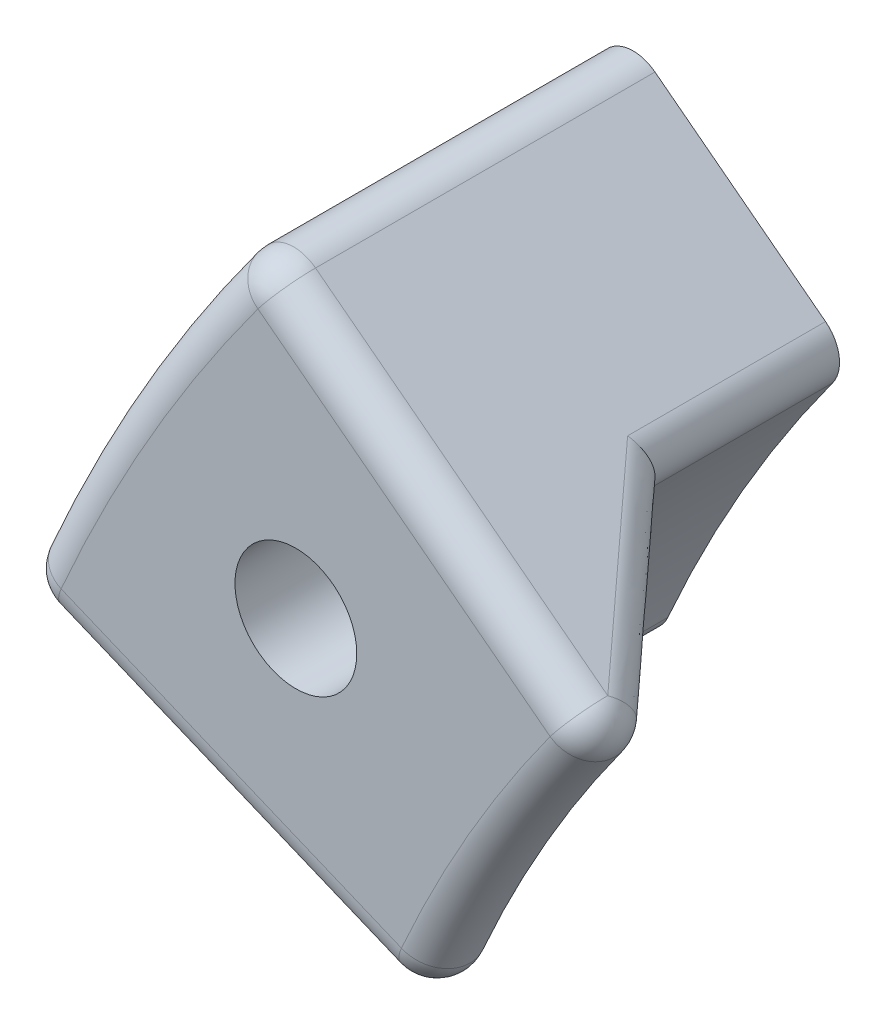
ISO-10303-21;
HEADER;
FILE_DESCRIPTION(('STEP AP214'),'2;1');
FILE_NAME('part.step','',(''),(''),'','','');
FILE_SCHEMA(('AUTOMOTIVE_DESIGN { 1 0 10303 214 1 1 1 1 }'));
ENDSEC;
DATA;
#1=APPLICATION_CONTEXT('core data for automotive mechanical design processes');
#2=APPLICATION_PROTOCOL_DEFINITION('international standard','automotive_design',2000,#1);
#3=PRODUCT_CONTEXT('',#1,'mechanical');
#4=PRODUCT('Part','Part','',(#3));
#5=PRODUCT_RELATED_PRODUCT_CATEGORY('part','',(#4));
#6=PRODUCT_DEFINITION_FORMATION('','',#4);
#7=PRODUCT_DEFINITION_CONTEXT('part definition',#1,'design');
#8=PRODUCT_DEFINITION('design','',#6,#7);
#9=PRODUCT_DEFINITION_SHAPE('','',#8);
#10=(LENGTH_UNIT() NAMED_UNIT(*) SI_UNIT(.MILLI.,.METRE.));
#11=(NAMED_UNIT(*) PLANE_ANGLE_UNIT() SI_UNIT($,.RADIAN.));
#12=(NAMED_UNIT(*) SI_UNIT($,.STERADIAN.) SOLID_ANGLE_UNIT());
#13=UNCERTAINTY_MEASURE_WITH_UNIT(LENGTH_MEASURE(1.E-05),#10,'distance_accuracy_value','');
#14=(GEOMETRIC_REPRESENTATION_CONTEXT(3) GLOBAL_UNCERTAINTY_ASSIGNED_CONTEXT((#13)) GLOBAL_UNIT_ASSIGNED_CONTEXT((#10,
#11,#12)) REPRESENTATION_CONTEXT('',''));
#15=CARTESIAN_POINT('',(0.,0.,0.));
#16=DIRECTION('',(0.,0.,1.));
#17=DIRECTION('',(1.,0.,0.));
#18=AXIS2_PLACEMENT_3D('',#15,#16,#17);
#19=CARTESIAN_POINT('',(0.,15.9999999999999,11.));
#20=DIRECTION('',(0.,0.,-1.));
#21=DIRECTION('',(-1.,0.,0.));
#22=AXIS2_PLACEMENT_3D('',#19,#20,#21);
#23=CYLINDRICAL_SURFACE('',#22,50.7);
#24=CARTESIAN_POINT('',(0.,15.9999999999999,0.));
#25=DIRECTION('',(0.,0.,-1.));
#26=DIRECTION('',(-1.,0.,0.));
#27=AXIS2_PLACEMENT_3D('',#24,#25,#26);
#28=CIRCLE('',#27,50.7);
#29=CARTESIAN_POINT('',(-46.4408264622342,36.3405908838619,0.));
#30=VERTEX_POINT('',#29);
#31=CARTESIAN_POINT('',(-40.8358816645273,46.048640047109,0.));
#32=VERTEX_POINT('',#31);
#33=EDGE_CURVE('E174',#30,#32,#28,.T.);
#34=ORIENTED_EDGE('',*,*,#33,.F.);
#35=DIRECTION('',(0.,0.,-1.));
#36=VECTOR('',#35,1.);
#37=CARTESIAN_POINT('',(-46.4408264622342,36.3405908838619,11.));
#38=LINE('',#37,#36);
#39=CARTESIAN_POINT('',(-46.4408264622342,36.3405908838619,9.47750838033255));
#40=VERTEX_POINT('',#39);
#41=EDGE_CURVE('E398',#30,#40,#38,.F.);
#42=ORIENTED_EDGE('',*,*,#41,.T.);
#43=CARTESIAN_POINT('',(0.,15.9999999999999,9.47750838033255));
#44=DIRECTION('',(0.,0.,1.));
#45=DIRECTION('',(1.,0.,0.));
#46=AXIS2_PLACEMENT_3D('',#43,#44,#45);
#47=CIRCLE('',#46,50.7);
#48=CARTESIAN_POINT('',(-40.8358816645273,46.048640047109,9.47750838033255));
#49=VERTEX_POINT('',#48);
#50=EDGE_CURVE('E392',#40,#49,#47,.F.);
#51=ORIENTED_EDGE('',*,*,#50,.T.);
#52=DIRECTION('',(0.,0.,-1.));
#53=VECTOR('',#52,1.);
#54=CARTESIAN_POINT('',(-40.8358816645273,46.048640047109,11.));
#55=LINE('',#54,#53);
#56=EDGE_CURVE('E395',#49,#32,#55,.T.);
#57=ORIENTED_EDGE('',*,*,#56,.T.);
#58=EDGE_LOOP('',(#34,#42,#51,#57));
#59=FACE_BOUND('',#58,.T.);
#60=ADVANCED_FACE('F45',(#59),#23,.T.);
#61=CARTESIAN_POINT('',(7.39103626009033,12.9385325410792,10.4775083803325));
#62=DIRECTION('',(0.,0.,1.));
#63=DIRECTION('',(1.,0.,0.));
#64=AXIS2_PLACEMENT_3D('',#61,#62,#63);
#65=PLANE('',#64);
#66=CARTESIAN_POINT('',(-38.9711431702996,38.5000000000002,10.4775083803325));
#67=DIRECTION('',(0.,0.,1.));
#68=DIRECTION('',(1.,0.,0.));
#69=AXIS2_PLACEMENT_3D('',#66,#67,#68);
#70=CIRCLE('',#69,1.70000000000001);
#71=CARTESIAN_POINT('',(-37.2711431702996,38.5000000000002,10.4775083803325));
#72=VERTEX_POINT('',#71);
#73=EDGE_CURVE('E290',#72,#72,#70,.T.);
#74=ORIENTED_EDGE('',*,*,#73,.F.);
#75=EDGE_LOOP('',(#74));
#76=FACE_BOUND('',#75,.T.);
#77=DIRECTION('',(0.793353340291231,-0.608761429008726,0.));
#78=VECTOR('',#77,1.);
#79=CARTESIAN_POINT('',(5.52180241707132,10.5024995690833,10.4775083803325));
#80=LINE('',#79,#78);
#81=CARTESIAN_POINT('',(-31.8715321637125,39.1954143634461,10.4775083803325));
#82=VERTEX_POINT('',#81);
#83=CARTESIAN_POINT('',(-40.0304402115781,45.4559647010122,10.4775083803325));
#84=VERTEX_POINT('',#83);
#85=EDGE_CURVE('E402',#82,#84,#80,.F.);
#86=ORIENTED_EDGE('',*,*,#85,.T.);
#87=CARTESIAN_POINT('',(0.,15.9999999999999,10.4775083803325));
#88=DIRECTION('',(0.,0.,1.));
#89=DIRECTION('',(1.,0.,0.));
#90=AXIS2_PLACEMENT_3D('',#87,#88,#89);
#91=CIRCLE('',#90,49.7);
#92=CARTESIAN_POINT('',(-45.524833829843,35.9393957973952,10.4775083803325));
#93=VERTEX_POINT('',#92);
#94=EDGE_CURVE('E156',#84,#93,#91,.T.);
#95=ORIENTED_EDGE('',*,*,#94,.T.);
#96=DIRECTION('',(0.923879532511285,-0.382683432365095,0.));
#97=VECTOR('',#96,1.);
#98=CARTESIAN_POINT('',(-33.672343951946,31.0299337420803,10.4775083803325));
#99=LINE('',#98,#97);
#100=CARTESIAN_POINT('',(-36.0235841719069,32.0038493295852,10.4775083803325));
#101=VERTEX_POINT('',#100);
#102=EDGE_CURVE('E362',#93,#101,#99,.T.);
#103=ORIENTED_EDGE('',*,*,#102,.T.);
#104=CARTESIAN_POINT('',(0.,15.9999999999999,10.4775083803325));
#105=DIRECTION('',(0.,0.,1.));
#106=DIRECTION('',(1.,0.,0.));
#107=AXIS2_PLACEMENT_3D('',#104,#105,#106);
#108=CIRCLE('',#107,39.4185465226019);
#109=EDGE_CURVE('E400',#101,#82,#108,.F.);
#110=ORIENTED_EDGE('',*,*,#109,.T.);
#111=EDGE_LOOP('',(#86,#95,#103,#110));
#112=FACE_BOUND('',#111,.T.);
#113=ADVANCED_FACE('F195',(#76,#112),#65,.T.);
#114=CARTESIAN_POINT('',(0.,15.9999999999999,10.4775083803325));
#115=DIRECTION('',(0.,0.,-1.));
#116=DIRECTION('',(-1.,0.,0.));
#117=AXIS2_PLACEMENT_3D('',#114,#115,#116);
#118=CONICAL_SURFACE('',#117,36.8608960215223,0.82537685052074);
#119=CARTESIAN_POINT('',(0.,15.9999999999999,8.74270493570506));
#120=DIRECTION('',(0.,0.,1.));
#121=DIRECTION('',(1.,0.,0.));
#122=AXIS2_PLACEMENT_3D('',#119,#120,#121);
#123=CIRCLE('',#122,38.7402664198688);
#124=CARTESIAN_POINT('',(-31.3231145274136,38.7962878246643,8.74270493570506));
#125=VERTEX_POINT('',#124);
#126=CARTESIAN_POINT('',(-35.4037216318479,31.7284689940578,8.74270493570506));
#127=VERTEX_POINT('',#126);
#128=EDGE_CURVE('E164',#125,#127,#123,.T.);
#129=ORIENTED_EDGE('',*,*,#128,.T.);
#130=CARTESIAN_POINT('',(-57.0560553569971,40.7041034612373,-12.8890269101578));
#131=CARTESIAN_POINT('',(-57.4412985100991,39.7929648832049,-12.8811819059078));
#132=CARTESIAN_POINT('',(-58.0611788304999,40.049727718963,-12.1542234655303));
#133=CARTESIAN_POINT('',(-53.6085180772676,39.2753423746649,-9.44467818698398));
#134=CARTESIAN_POINT('',(-53.9937501242067,38.3649435848307,-9.43617150696224));
#135=CARTESIAN_POINT('',(-54.6133667642921,38.6215972006262,-8.70987474235716));
#136=CARTESIAN_POINT('',(-50.160981542416,37.8465493087946,-6.00034038840782));
#137=CARTESIAN_POINT('',(-50.5477800955023,36.9375760634102,-5.99271766851962));
#138=CARTESIAN_POINT('',(-51.1655453720429,37.1934628193164,-5.26553694378046));
#139=CARTESIAN_POINT('',(-43.2659503160032,34.9885137912344,0.888176626190312));
#140=CARTESIAN_POINT('',(-43.6538842403825,34.0820309026318,0.896426533633099));
#141=CARTESIAN_POINT('',(-44.2697674695047,34.3371380889724,1.62298007081854));
#142=CARTESIAN_POINT('',(-39.8184556244414,33.5592713395513,4.33235584221468));
#143=CARTESIAN_POINT('',(-40.2074205279736,32.6544588907253,4.34065553151519));
#144=CARTESIAN_POINT('',(-40.8218109592178,32.9089477399389,5.06715928684324));
#145=CARTESIAN_POINT('',(-34.6472751144234,31.4147815023974,9.49840329950107));
#146=CARTESIAN_POINT('',(-35.034658844084,30.5118308463343,9.51045366323894));
#147=CARTESIAN_POINT('',(-35.649687385489,30.7665840094308,10.233206744128));
#148=CARTESIAN_POINT('',(-32.9235585112219,30.6998471879928,11.2203822451988));
#149=CARTESIAN_POINT('',(-33.3113881168769,29.7980287394846,11.23280201));
#150=CARTESIAN_POINT('',(-33.9256147051076,30.0524497226999,11.9551856898249));
#151=CARTESIAN_POINT('',(-29.4761609490719,29.2696373801796,14.664219140246));
#152=CARTESIAN_POINT('',(-29.8644724464889,28.3702695204535,14.6780839910781));
#153=CARTESIAN_POINT('',(-30.4773662152739,28.6241384317782,15.3990225848749));
#154=CARTESIAN_POINT('',(-27.7524799901233,28.5543618867728,16.386077089596));
#155=CARTESIAN_POINT('',(-28.1413806570758,27.6565415320648,16.4004645185635));
#156=CARTESIAN_POINT('',(-28.7531904058223,27.9099614275877,17.1208805342287));
#157=CARTESIAN_POINT('',(-24.3051801872967,27.1232514841119,19.8295940307751));
#158=CARTESIAN_POINT('',(-24.6947615808185,26.2289051663452,19.8460046580516));
#159=CARTESIAN_POINT('',(-25.3046691372555,26.4815371480152,20.5643974754077));
#160=CARTESIAN_POINT('',(-22.58156134342,26.4074165748464,21.5512530226));
#161=CARTESIAN_POINT('',(-22.9721393065628,25.5153716575025,21.5682590461862));
#162=CARTESIAN_POINT('',(-23.5803236781369,25.7672898726319,22.2860564672288));
#163=CARTESIAN_POINT('',(-19.9962294741058,25.3328740200403,24.1334589348808));
#164=CARTESIAN_POINT('',(-20.3860935203517,24.444196419936,24.1542328372365));
#165=CARTESIAN_POINT('',(-20.9935646826547,24.6958192141125,24.868262379508));
#166=CARTESIAN_POINT('',(-19.1344682428935,24.9745614668214,24.9941471505793));
#167=CARTESIAN_POINT('',(-19.5247543873657,24.0874180692506,25.0156277247592));
#168=CARTESIAN_POINT('',(-20.1312715421626,24.3386457005794,25.7289505952066));
#169=CARTESIAN_POINT('',(-17.4109994573508,24.257530602391,26.7153777212736));
#170=CARTESIAN_POINT('',(-17.8018167429931,23.3737539298282,26.7389207855883));
#171=CARTESIAN_POINT('',(-18.4065609993268,23.6242472025689,27.4501811659012));
#172=CARTESIAN_POINT('',(-16.549291903021,23.8988122911757,27.575920076268));
#173=CARTESIAN_POINT('',(-16.9405453347794,23.017003631662,27.6004914454683));
#174=CARTESIAN_POINT('',(-17.5441435969817,23.267022218091,28.3107235208959));
#175=CARTESIAN_POINT('',(-15.6876219653317,23.5398199228824,28.436363660635));
#176=CARTESIAN_POINT('',(-16.0785716113142,22.6599624249934,28.4629280870104));
#177=CARTESIAN_POINT('',(-16.6816420730981,22.909762389331,29.1711671052625));
#178=(BOUNDED_SURFACE() B_SPLINE_SURFACE(3,2,((#130,#131,#132),(#133,#134,#135),(#136,#137,
#138),(#139,#140,#141),(#142,#143,#144),(#145,#146,#147),(#148,#149,#150),(#151,#152,#153),
(#154,#155,#156),(#157,#158,#159),(#160,#161,#162),(#163,#164,#165),(#166,#167,#168),(#169,#170,
#171),(#172,#173,#174),(#175,#176,#177)),.UNSPECIFIED.,.F.,.F.,
.F.) B_SPLINE_SURFACE_WITH_KNOTS((4,2,2,2,2,2,2,4),(3,3),(0.,15.2353052798517,30.4706103295352,
38.0882630407243,45.7059157124317,53.3235685387299,57.1323950183959,60.9412215349687),(0.,1.),
.UNSPECIFIED.) GEOMETRIC_REPRESENTATION_ITEM() RATIONAL_B_SPLINE_SURFACE(((1.,0.710911929970982,
1.),(1.,0.711153587269838,1.),(1.,0.711405958849922,1.),(1.,0.712061621390674,1.),(1.,
0.712464912349062,1.),(1.,0.713280156441932,1.),(1.,0.713586955753808,1.),(1.,0.714315174736751,
1.),(1.,0.714736594407223,1.),(1.,0.715767409611829,1.),(1.,0.716376805149779,1.),(1.,
0.717556536238839,1.),(1.,0.717994052903862,1.),(1.,0.719005547590785,1.),(1.,0.719579525614007,
1.),(1.,0.720245692027132,1.))) REPRESENTATION_ITEM('') SURFACE());
#179=CARTESIAN_POINT('',(-15.6876219653317,23.5398199228824,28.436363660635));
#180=CARTESIAN_POINT('',(-16.549291903021,23.8988122911757,27.575920076268));
#181=CARTESIAN_POINT('',(-17.4109994573508,24.257530602391,26.7153777212736));
#182=CARTESIAN_POINT('',(-19.1344682428935,24.9745614668214,24.9941471505793));
#183=CARTESIAN_POINT('',(-19.9962294741058,25.3328740200403,24.1334589348808));
#184=CARTESIAN_POINT('',(-22.58156134342,26.4074165748464,21.5512530226));
#185=CARTESIAN_POINT('',(-24.3051801872967,27.1232514841119,19.8295940307751));
#186=CARTESIAN_POINT('',(-27.7524799901233,28.5543618867728,16.386077089596));
#187=CARTESIAN_POINT('',(-29.4761609490719,29.2696373801796,14.664219140246));
#188=CARTESIAN_POINT('',(-32.9235585112219,30.6998471879928,11.2203822451988));
#189=CARTESIAN_POINT('',(-34.6472751144234,31.4147815023974,9.49840329950107));
#190=CARTESIAN_POINT('',(-39.8184556244414,33.5592713395513,4.33235584221468));
#191=CARTESIAN_POINT('',(-43.2659503160032,34.9885137912344,0.888176626190309));
#192=CARTESIAN_POINT('',(-50.160981542416,37.8465493087946,-6.00034038840781));
#193=CARTESIAN_POINT('',(-53.6085180772676,39.2753423746649,-9.44467818698397));
#194=CARTESIAN_POINT('',(-57.0560553569971,40.7041034612373,-12.8890269101578));
#195=B_SPLINE_CURVE_WITH_KNOTS('',3,(#179,#180,#181,#182,#183,#184,#185,#186,#187,#188,#189,
#190,#191,#192,#193,#194),.UNSPECIFIED.,.F.,.F.,(4,2,2,2,2,2,2,4),(0.,3.80882651657277,
7.61765299623877,15.235305822537,22.8529584942444,30.4706112054334,45.705916255117,
60.9412215349687),.UNSPECIFIED.);
#196=CARTESIAN_POINT('',(-39.0624724144514,33.2456733376875,5.08756624635315));
#197=VERTEX_POINT('',#196);
#198=EDGE_CURVE('E152',#127,#197,#195,.T.);
#199=ORIENTED_EDGE('',*,*,#198,.T.);
#200=CARTESIAN_POINT('',(0.,15.9999999999999,5.08756624635315));
#201=DIRECTION('',(0.,0.,-1.));
#202=DIRECTION('',(-1.,0.,0.));
#203=AXIS2_PLACEMENT_3D('',#200,#201,#202);
#204=CIRCLE('',#203,42.7);
#205=CARTESIAN_POINT('',(-34.4664274230308,41.2062567767004,5.08756624635315));
#206=VERTEX_POINT('',#205);
#207=EDGE_CURVE('E161',#197,#206,#204,.T.);
#208=ORIENTED_EDGE('',*,*,#207,.T.);
#209=CARTESIAN_POINT('',(-27.6852817804571,36.0077333479931,12.9722831735129));
#210=CARTESIAN_POINT('',(-27.0986461547945,36.7935225322664,12.9863168379847));
#211=CARTESIAN_POINT('',(-27.6262672041879,37.1983804028917,13.7070866181404));
#212=CARTESIAN_POINT('',(-28.4301556209873,36.5786341069799,12.1063274222114));
#213=CARTESIAN_POINT('',(-27.8431226662879,37.3647794514517,12.1197655074681));
#214=CARTESIAN_POINT('',(-28.3708337284711,37.7697063913199,12.8411308668389));
#215=CARTESIAN_POINT('',(-29.1749939251547,37.1495606462699,11.2403561871437));
#216=CARTESIAN_POINT('',(-28.5873921531294,37.9358775150344,11.2534821721267));
#217=CARTESIAN_POINT('',(-29.1153889180281,38.3410236823067,11.9751596317712));
#218=CARTESIAN_POINT('',(-30.6646134305598,38.2914549552782,9.50838889756597));
#219=CARTESIAN_POINT('',(-30.0759924519179,39.0781206986084,9.52088757750443));
#220=CARTESIAN_POINT('',(-30.604481126791,39.4836443216797,10.2431923421935));
#221=CARTESIAN_POINT('',(-31.4093946317975,38.8624227249965,8.64239284305605));
#222=CARTESIAN_POINT('',(-30.8202741597744,39.6492281397057,8.65463349005064));
#223=CARTESIAN_POINT('',(-31.349018145997,40.0549476700659,9.37719628768353));
#224=CARTESIAN_POINT('',(-35.0127918978318,41.6250313272277,4.45236788722416));
#225=CARTESIAN_POINT('',(-34.4235701911246,42.4141344302383,4.46091129059091));
#226=CARTESIAN_POINT('',(-34.9513052505917,42.8190797838701,5.18717133185165));
#227=CARTESIAN_POINT('',(-37.871111799266,43.8168843385272,1.12821077319941));
#228=CARTESIAN_POINT('',(-37.2800210856329,44.6059662914312,1.13665265313202));
#229=CARTESIAN_POINT('',(-37.8089614700305,45.0118365234114,1.86301421782692));
#230=CARTESIAN_POINT('',(-43.5874016297553,48.2008383653572,-5.52025413191054));
#231=CARTESIAN_POINT('',(-42.9937103584226,48.9902342713686,-5.51251351431314));
#232=CARTESIAN_POINT('',(-43.524163599225,49.3972653588972,-4.78545068728302));
#233=CARTESIAN_POINT('',(-46.4453715588095,50.3929393808884,-8.84456192299612));
#234=CARTESIAN_POINT('',(-45.8497971808394,51.1817867702201,-8.83608070721259));
#235=CARTESIAN_POINT('',(-46.3817095089803,51.5899374548415,-8.1097584783686));
#236=CARTESIAN_POINT('',(-49.303309237866,52.5850607659501,-12.1688828339845));
#237=CARTESIAN_POINT('',(-48.7070156260032,53.3742075937457,-12.1609402962573));
#238=CARTESIAN_POINT('',(-49.2392458030807,53.782602172434,-11.434079389357));
#239=(BOUNDED_SURFACE() B_SPLINE_SURFACE(3,2,((#209,#210,#211),(#212,#213,#214),(#215,#216,
#217),(#218,#219,#220),(#221,#222,#223),(#224,#225,#226),(#227,#228,#229),(#230,#231,#232),
(#233,#234,#235),(#236,#237,#238)),.UNSPECIFIED.,.F.,.F.,.F.) B_SPLINE_SURFACE_WITH_KNOTS((4,2,
2,2,4),(3,3),(0.,3.83093311252118,7.66186622261852,22.3662742399369,37.0706822936641),(0.,1.),
.UNSPECIFIED.) GEOMETRIC_REPRESENTATION_ITEM() RATIONAL_B_SPLINE_SURFACE(((1.,0.713957416134274,
1.),(1.,0.713773777055552,1.),(1.,0.713604807373312,1.),(1.,0.713290405298534,1.),(1.,
0.713144972905981,1.),(1.,0.712484227988163,1.),(1.,0.712090696663566,1.),(1.,0.711447059710365,
1.),(1.,0.711196954082115,1.),(1.,0.710959625056789,1.))) REPRESENTATION_ITEM('') SURFACE());
#240=CARTESIAN_POINT('',(-49.303309237866,52.5850607659501,-12.1688828339845));
#241=CARTESIAN_POINT('',(-46.4453715588095,50.3929393808884,-8.84456192299613));
#242=CARTESIAN_POINT('',(-43.5874016297553,48.2008383653572,-5.52025413191054));
#243=CARTESIAN_POINT('',(-37.871111799266,43.8168843385272,1.12821077319942));
#244=CARTESIAN_POINT('',(-35.0127918978318,41.6250313272277,4.45236788722416));
#245=CARTESIAN_POINT('',(-31.4093946317975,38.8624227249965,8.64239284305605));
#246=CARTESIAN_POINT('',(-30.6646134305598,38.2914549552782,9.50838889756597));
#247=CARTESIAN_POINT('',(-29.1749939251547,37.1495606462699,11.2403561871437));
#248=CARTESIAN_POINT('',(-28.4301556209873,36.5786341069799,12.1063274222114));
#249=CARTESIAN_POINT('',(-27.6852817804571,36.0077333479931,12.9722831735129));
#250=B_SPLINE_CURVE_WITH_KNOTS('',3,(#240,#241,#242,#243,#244,#245,#246,#247,#248,#249),
.UNSPECIFIED.,.F.,.F.,(4,2,2,2,4),(0.,14.7044080537272,29.4088160710455,33.2397491811429,
37.0706822936641),.UNSPECIFIED.);
#251=EDGE_CURVE('E167',#206,#125,#250,.T.);
#252=ORIENTED_EDGE('',*,*,#251,.T.);
#253=EDGE_LOOP('',(#129,#199,#208,#252));
#254=FACE_BOUND('',#253,.T.);
#255=ADVANCED_FACE('F160',(#254),#118,.F.);
#256=CARTESIAN_POINT('',(0.,15.9999999999999,11.));
#257=DIRECTION('',(0.,0.,-1.));
#258=DIRECTION('',(-1.,0.,0.));
#259=AXIS2_PLACEMENT_3D('',#256,#257,#258);
#260=CYLINDRICAL_SURFACE('',#259,42.7);
#261=CARTESIAN_POINT('',(-39.0624724144514,33.2456733376875,5.08756624635315));
#262=CARTESIAN_POINT('',(-39.0629603622518,33.2445681069912,5.08756912303929));
#263=CARTESIAN_POINT('',(-39.0634482599319,33.2434628628693,5.08757358779598));
#264=CARTESIAN_POINT('',(-39.0644239550518,33.2412523477741,5.08758569345047));
#265=CARTESIAN_POINT('',(-39.0649117524915,33.2401470768008,5.08759333434827));
#266=CARTESIAN_POINT('',(-39.0653994998109,33.2390417924019,5.08760256331662));
#267=B_SPLINE_CURVE_WITH_KNOTS('',3,(#261,#262,#263,#264,#265,#266),.UNSPECIFIED.,.F.,.F.,(4,2,
4),(0.,0.00362445276482859,0.00724890553028644),.UNSPECIFIED.);
#268=CARTESIAN_POINT('',(-39.0653994998109,33.2390417924019,5.08760256331663));
#269=VERTEX_POINT('',#268);
#270=EDGE_CURVE('E54',#197,#269,#267,.T.);
#271=ORIENTED_EDGE('',*,*,#270,.T.);
#272=DIRECTION('',(0.,0.,-1.));
#273=VECTOR('',#272,1.);
#274=CARTESIAN_POINT('',(-39.0653994998109,33.2390417924019,11.));
#275=LINE('',#274,#273);
#276=CARTESIAN_POINT('',(-39.0653994998109,33.2390417924019,0.));
#277=VERTEX_POINT('',#276);
#278=EDGE_CURVE('E69',#269,#277,#275,.T.);
#279=ORIENTED_EDGE('',*,*,#278,.T.);
#280=CARTESIAN_POINT('',(0.,15.9999999999999,0.));
#281=DIRECTION('',(0.,0.,-1.));
#282=DIRECTION('',(-1.,0.,0.));
#283=AXIS2_PLACEMENT_3D('',#280,#281,#282);
#284=CIRCLE('',#283,42.7);
#285=CARTESIAN_POINT('',(-34.4621478790268,41.2121074796235,0.));
#286=VERTEX_POINT('',#285);
#287=EDGE_CURVE('E171',#277,#286,#284,.T.);
#288=ORIENTED_EDGE('',*,*,#287,.T.);
#289=DIRECTION('',(0.,0.,-1.));
#290=VECTOR('',#289,1.);
#291=CARTESIAN_POINT('',(-34.4621478790268,41.2121074796235,11.));
#292=LINE('',#291,#290);
#293=CARTESIAN_POINT('',(-34.4621478790268,41.2121074796235,5.08760256331663));
#294=VERTEX_POINT('',#293);
#295=EDGE_CURVE('E61',#286,#294,#292,.F.);
#296=ORIENTED_EDGE('',*,*,#295,.T.);
#297=CARTESIAN_POINT('',(-34.4621478790268,41.2121074796235,5.08760256331663));
#298=CARTESIAN_POINT('',(-34.4628612085772,41.2111324374377,5.0875929429222));
#299=CARTESIAN_POINT('',(-34.4635745020194,41.2101573577678,5.08758510631137));
#300=CARTESIAN_POINT('',(-34.4650010166874,41.2082071234601,5.08757300065687));
#301=CARTESIAN_POINT('',(-34.4657142379132,41.2072319688222,5.08756873161321));
#302=CARTESIAN_POINT('',(-34.4664274230308,41.2062567767004,5.08756624635314));
#303=B_SPLINE_CURVE_WITH_KNOTS('',3,(#297,#298,#299,#300,#301,#302),.UNSPECIFIED.,.F.,.F.,(4,2,
4),(0.,0.00362445358479977,0.0072489071689912),.UNSPECIFIED.);
#304=EDGE_CURVE('E11',#294,#206,#303,.T.);
#305=ORIENTED_EDGE('',*,*,#304,.T.);
#306=ORIENTED_EDGE('',*,*,#207,.F.);
#307=EDGE_LOOP('',(#271,#279,#288,#296,#305,#306));
#308=FACE_BOUND('',#307,.T.);
#309=ADVANCED_FACE('F169',(#308),#260,.F.);
#310=CARTESIAN_POINT('',(7.39103626009033,12.9385325410792,0.));
#311=DIRECTION('',(0.,0.,-1.));
#312=DIRECTION('',(-1.,0.,0.));
#313=AXIS2_PLACEMENT_3D('',#310,#311,#312);
#314=PLANE('',#313);
#315=CARTESIAN_POINT('',(-38.9711431702996,38.5000000000002,0.));
#316=DIRECTION('',(0.,0.,1.));
#317=DIRECTION('',(1.,0.,0.));
#318=AXIS2_PLACEMENT_3D('',#315,#316,#317);
#319=CIRCLE('',#318,1.70000000000001);
#320=CARTESIAN_POINT('',(-37.2711431702996,38.5000000000002,0.));
#321=VERTEX_POINT('',#320);
#322=EDGE_CURVE('E642',#321,#321,#319,.T.);
#323=ORIENTED_EDGE('',*,*,#322,.T.);
#324=EDGE_LOOP('',(#323));
#325=FACE_BOUND('',#324,.T.);
#326=ORIENTED_EDGE('',*,*,#287,.F.);
#327=CARTESIAN_POINT('',(-39.9802800501577,33.6427664245424,0.));
#328=DIRECTION('',(0.,0.,-1.));
#329=DIRECTION('',(-1.,0.,0.));
#330=AXIS2_PLACEMENT_3D('',#327,#328,#329);
#331=CIRCLE('',#330,1.);
#332=CARTESIAN_POINT('',(-40.3629634825228,32.7188868920312,0.));
#333=VERTEX_POINT('',#332);
#334=EDGE_CURVE('E452',#277,#333,#331,.T.);
#335=ORIENTED_EDGE('',*,*,#334,.T.);
#336=DIRECTION('',(-0.923879532511285,0.382683432365095,0.));
#337=VECTOR('',#336,1.);
#338=CARTESIAN_POINT('',(7.39103626009033,12.9385325410792,0.));
#339=LINE('',#338,#337);
#340=CARTESIAN_POINT('',(-45.9075172622081,35.0155162648839,0.));
#341=VERTEX_POINT('',#340);
#342=EDGE_CURVE('E436',#333,#341,#339,.T.);
#343=ORIENTED_EDGE('',*,*,#342,.T.);
#344=CARTESIAN_POINT('',(-45.524833829843,35.9393957973952,0.));
#345=DIRECTION('',(0.,0.,-1.));
#346=DIRECTION('',(-1.,0.,0.));
#347=AXIS2_PLACEMENT_3D('',#344,#345,#346);
#348=CIRCLE('',#347,1.);
#349=EDGE_CURVE('E443',#341,#30,#348,.T.);
#350=ORIENTED_EDGE('',*,*,#349,.T.);
#351=ORIENTED_EDGE('',*,*,#33,.T.);
#352=CARTESIAN_POINT('',(-40.0304402115781,45.4559647010122,0.));
#353=DIRECTION('',(0.,0.,-1.));
#354=DIRECTION('',(-1.,0.,0.));
#355=AXIS2_PLACEMENT_3D('',#352,#353,#354);
#356=CIRCLE('',#355,1.);
#357=CARTESIAN_POINT('',(-39.4216787825693,46.2493180413034,0.));
#358=VERTEX_POINT('',#357);
#359=EDGE_CURVE('E435',#32,#358,#356,.T.);
#360=ORIENTED_EDGE('',*,*,#359,.T.);
#361=DIRECTION('',(-0.793353340291231,0.608761429008726,0.));
#362=VECTOR('',#361,1.);
#363=CARTESIAN_POINT('',(6.34682672232991,11.1299085679301,0.));
#364=LINE('',#363,#362);
#365=CARTESIAN_POINT('',(-34.6604625127588,42.5959083018732,0.));
#366=VERTEX_POINT('',#365);
#367=EDGE_CURVE('E416',#366,#358,#364,.T.);
#368=ORIENTED_EDGE('',*,*,#367,.F.);
#369=CARTESIAN_POINT('',(-35.2692239417675,41.8025549615819,0.));
#370=DIRECTION('',(0.,0.,-1.));
#371=DIRECTION('',(-1.,0.,0.));
#372=AXIS2_PLACEMENT_3D('',#369,#370,#371);
#373=CIRCLE('',#372,1.);
#374=EDGE_CURVE('E426',#366,#286,#373,.T.);
#375=ORIENTED_EDGE('',*,*,#374,.T.);
#376=EDGE_LOOP('',(#326,#335,#343,#350,#351,#360,#368,#375));
#377=FACE_BOUND('',#376,.T.);
#378=ADVANCED_FACE('F267',(#325,#377),#314,.T.);
#379=CARTESIAN_POINT('',(7.39103626009033,12.9385325410792,0.));
#380=DIRECTION('',(0.382683432365095,0.923879532511285,0.));
#381=DIRECTION('',(-0.923879532511285,0.382683432365095,0.));
#382=AXIS2_PLACEMENT_3D('',#379,#380,#381);
#383=PLANE('',#382);
#384=ORIENTED_EDGE('',*,*,#342,.F.);
#385=DIRECTION('',(0.,0.,1.));
#386=VECTOR('',#385,1.);
#387=CARTESIAN_POINT('',(-40.3629634825228,32.7188868920312,5.08756624635315));
#388=LINE('',#387,#386);
#389=CARTESIAN_POINT('',(-40.3629634825228,32.7188868920312,5.52539747811885));
#390=VERTEX_POINT('',#389);
#391=EDGE_CURVE('E376',#333,#390,#388,.T.);
#392=ORIENTED_EDGE('',*,*,#391,.T.);
#393=CARTESIAN_POINT('',(-58.0611788304999,40.049727718963,-12.1542234655303));
#394=CARTESIAN_POINT('',(-54.6133667642921,38.6215972006262,-8.70987474235715));
#395=CARTESIAN_POINT('',(-51.1655453720429,37.1934628193164,-5.26553694378046));
#396=CARTESIAN_POINT('',(-44.2697674695047,34.3371380889724,1.62298007081854));
#397=CARTESIAN_POINT('',(-40.8218109592178,32.9089477399389,5.06715928684324));
#398=CARTESIAN_POINT('',(-35.649687385489,30.7665840094308,10.233206744128));
#399=CARTESIAN_POINT('',(-33.9256147051076,30.0524497226999,11.9551856898249));
#400=CARTESIAN_POINT('',(-30.4773662152739,28.6241384317782,15.3990225848749));
#401=CARTESIAN_POINT('',(-28.7531904058223,27.9099614275877,17.1208805342287));
#402=CARTESIAN_POINT('',(-25.3046691372555,26.4815371480153,20.5643974754077));
#403=CARTESIAN_POINT('',(-23.5803236781369,25.7672898726319,22.2860564672288));
#404=CARTESIAN_POINT('',(-20.9935646826547,24.6958192141125,24.868262379508));
#405=CARTESIAN_POINT('',(-20.1312715421626,24.3386457005794,25.7289505952066));
#406=CARTESIAN_POINT('',(-18.4065609993268,23.6242472025689,27.4501811659012));
#407=CARTESIAN_POINT('',(-17.5441435969817,23.267022218091,28.3107235208959));
#408=CARTESIAN_POINT('',(-16.6816420730981,22.909762389331,29.1711671052625));
#409=B_SPLINE_CURVE_WITH_KNOTS('',3,(#393,#394,#395,#396,#397,#398,#399,#400,#401,#402,#403,
#404,#405,#406,#407,#408),.UNSPECIFIED.,.F.,.F.,(4,2,2,2,2,2,2,4),(0.,15.2353052798517,
30.4706103295352,38.0882630407243,45.7059157124317,53.3235685387299,57.1323950183959,
60.9412215349687),.UNSPECIFIED.);
#410=CARTESIAN_POINT('',(-36.406267604272,31.0799697970739,9.47750838033255));
#411=VERTEX_POINT('',#410);
#412=EDGE_CURVE('E359',#390,#411,#409,.T.);
#413=ORIENTED_EDGE('',*,*,#412,.T.);
#414=DIRECTION('',(0.923879532511285,-0.382683432365095,0.));
#415=VECTOR('',#414,1.);
#416=CARTESIAN_POINT('',(-46.8406922983222,35.4020500209103,9.47750838033255));
#417=LINE('',#416,#415);
#418=CARTESIAN_POINT('',(-45.9075172622081,35.0155162648839,9.47750838033255));
#419=VERTEX_POINT('',#418);
#420=EDGE_CURVE('E166',#411,#419,#417,.F.);
#421=ORIENTED_EDGE('',*,*,#420,.T.);
#422=DIRECTION('',(0.,0.,1.));
#423=VECTOR('',#422,1.);
#424=CARTESIAN_POINT('',(-45.9075172622081,35.0155162648839,0.));
#425=LINE('',#424,#423);
#426=EDGE_CURVE('E366',#419,#341,#425,.F.);
#427=ORIENTED_EDGE('',*,*,#426,.T.);
#428=EDGE_LOOP('',(#384,#392,#413,#421,#427));
#429=FACE_BOUND('',#428,.T.);
#430=ADVANCED_FACE('F265',(#429),#383,.F.);
#431=CARTESIAN_POINT('',(6.34682672232991,11.1299085679301,0.));
#432=DIRECTION('',(0.608761429008726,0.793353340291231,0.));
#433=DIRECTION('',(-0.793353340291231,0.608761429008726,0.));
#434=AXIS2_PLACEMENT_3D('',#431,#432,#433);
#435=PLANE('',#434);
#436=CARTESIAN_POINT('',(-27.6262672041879,37.1983804028917,13.7070866181404));
#437=CARTESIAN_POINT('',(-28.3708337284711,37.7697063913199,12.8411308668389));
#438=CARTESIAN_POINT('',(-29.1153889180281,38.3410236823067,11.9751596317712));
#439=CARTESIAN_POINT('',(-30.604481126791,39.4836443216797,10.2431923421935));
#440=CARTESIAN_POINT('',(-31.349018145997,40.0549476700659,9.37719628768353));
#441=CARTESIAN_POINT('',(-34.9513052505917,42.8190797838701,5.18717133185165));
#442=CARTESIAN_POINT('',(-37.8089614700305,45.0118365234115,1.86301421782692));
#443=CARTESIAN_POINT('',(-43.524163599225,49.3972653588972,-4.78545068728302));
#444=CARTESIAN_POINT('',(-46.3817095089803,51.5899374548415,-8.10975847836861));
#445=CARTESIAN_POINT('',(-49.2392458030807,53.782602172434,-11.434079389357));
#446=B_SPLINE_CURVE_WITH_KNOTS('',3,(#436,#437,#438,#439,#440,#441,#442,#443,#444,#445),
.UNSPECIFIED.,.F.,.F.,(4,2,2,2,4),(0.,3.83093311252118,7.66186622261852,22.3662742399369,
37.0706822936641),.UNSPECIFIED.);
#447=CARTESIAN_POINT('',(-31.2627707347038,39.9887677037373,9.47750838033255));
#448=VERTEX_POINT('',#447);
#449=CARTESIAN_POINT('',(-34.6604625127588,42.5959083018732,5.52539747811884));
#450=VERTEX_POINT('',#449);
#451=EDGE_CURVE('E381',#448,#450,#446,.T.);
#452=ORIENTED_EDGE('',*,*,#451,.T.);
#453=DIRECTION('',(0.,0.,-1.));
#454=VECTOR('',#453,1.);
#455=CARTESIAN_POINT('',(-34.6604625127588,42.5959083018732,0.));
#456=LINE('',#455,#454);
#457=EDGE_CURVE('E388',#450,#366,#456,.T.);
#458=ORIENTED_EDGE('',*,*,#457,.T.);
#459=ORIENTED_EDGE('',*,*,#367,.T.);
#460=DIRECTION('',(0.,0.,-1.));
#461=VECTOR('',#460,1.);
#462=CARTESIAN_POINT('',(-39.4216787825693,46.2493180413034,0.));
#463=LINE('',#462,#461);
#464=CARTESIAN_POINT('',(-39.4216787825693,46.2493180413034,9.47750838033255));
#465=VERTEX_POINT('',#464);
#466=EDGE_CURVE('E389',#358,#465,#463,.F.);
#467=ORIENTED_EDGE('',*,*,#466,.T.);
#468=DIRECTION('',(0.793353340291231,-0.608761429008726,0.));
#469=VECTOR('',#468,1.);
#470=CARTESIAN_POINT('',(6.34682672232991,11.1299085679301,9.47750838033255));
#471=LINE('',#470,#469);
#472=EDGE_CURVE('E453',#465,#448,#471,.T.);
#473=ORIENTED_EDGE('',*,*,#472,.T.);
#474=EDGE_LOOP('',(#452,#458,#459,#467,#473));
#475=FACE_BOUND('',#474,.T.);
#476=ADVANCED_FACE('F217',(#475),#435,.T.);
#477=CARTESIAN_POINT('',(-40.0304402115781,45.4559647010122,11.));
#478=DIRECTION('',(0.,0.,-1.));
#479=DIRECTION('',(-1.,0.,0.));
#480=AXIS2_PLACEMENT_3D('',#477,#478,#479);
#481=CYLINDRICAL_SURFACE('',#480,1.);
#482=CARTESIAN_POINT('',(-40.0304402115781,45.4559647010122,9.47750838033255));
#483=DIRECTION('',(0.,0.,1.));
#484=DIRECTION('',(1.,0.,0.));
#485=AXIS2_PLACEMENT_3D('',#482,#483,#484);
#486=CIRCLE('',#485,1.);
#487=EDGE_CURVE('E49',#465,#49,#486,.T.);
#488=ORIENTED_EDGE('',*,*,#487,.F.);
#489=ORIENTED_EDGE('',*,*,#466,.F.);
#490=ORIENTED_EDGE('',*,*,#359,.F.);
#491=ORIENTED_EDGE('',*,*,#56,.F.);
#492=EDGE_LOOP('',(#488,#489,#490,#491));
#493=FACE_BOUND('',#492,.T.);
#494=ADVANCED_FACE('F47',(#493),#481,.T.);
#495=CARTESIAN_POINT('',(-40.0304402115781,45.4559647010122,9.47750838033255));
#496=DIRECTION('',(0.,0.,1.));
#497=DIRECTION('',(1.,0.,0.));
#498=AXIS2_PLACEMENT_3D('',#495,#496,#497);
#499=SPHERICAL_SURFACE('',#498,1.);
#500=CARTESIAN_POINT('',(-40.0304402115781,45.4559647010122,9.47750838033255));
#501=DIRECTION('',(-0.793353340291234,0.608761429008722,0.));
#502=DIRECTION('',(-0.608761429008722,-0.793353340291234,0.));
#503=AXIS2_PLACEMENT_3D('',#500,#501,#502);
#504=CIRCLE('',#503,1.);
#505=EDGE_CURVE('E233',#465,#84,#504,.F.);
#506=ORIENTED_EDGE('',*,*,#505,.F.);
#507=ORIENTED_EDGE('',*,*,#487,.T.);
#508=CARTESIAN_POINT('',(-40.0304402115781,45.4559647010122,9.47750838033255));
#509=DIRECTION('',(0.592675346096824,0.805441452949257,0.));
#510=DIRECTION('',(-0.805441452949257,0.592675346096824,0.));
#511=AXIS2_PLACEMENT_3D('',#508,#509,#510);
#512=CIRCLE('',#511,1.);
#513=EDGE_CURVE('E413',#84,#49,#512,.F.);
#514=ORIENTED_EDGE('',*,*,#513,.F.);
#515=EDGE_LOOP('',(#506,#507,#514));
#516=FACE_BOUND('',#515,.T.);
#517=ADVANCED_FACE('F246',(#516),#499,.T.);
#518=CARTESIAN_POINT('',(-35.2692239417675,41.8025549615819,11.));
#519=DIRECTION('',(0.,0.,-1.));
#520=DIRECTION('',(-1.,0.,0.));
#521=AXIS2_PLACEMENT_3D('',#518,#519,#520);
#522=CYLINDRICAL_SURFACE('',#521,1.);
#523=ORIENTED_EDGE('',*,*,#374,.F.);
#524=ORIENTED_EDGE('',*,*,#457,.F.);
#525=CARTESIAN_POINT('',(-34.4621478790268,41.2121074796235,5.08760256331663));
#526=CARTESIAN_POINT('',(-34.4464903254785,41.2335079948996,5.08786982041529));
#527=CARTESIAN_POINT('',(-34.4316969228134,41.2555181073251,5.08859904948764));
#528=CARTESIAN_POINT('',(-34.4039244868078,41.3006008722903,5.09096986406343));
#529=CARTESIAN_POINT('',(-34.3909450262786,41.3236732729507,5.09261123430037));
#530=CARTESIAN_POINT('',(-34.3549406607309,41.3940797540389,5.09887026544343));
#531=CARTESIAN_POINT('',(-34.3347255205198,41.4427736527539,5.10482515359482));
#532=CARTESIAN_POINT('',(-34.3022963286284,41.5421919068402,5.1200624633533));
#533=CARTESIAN_POINT('',(-34.2900787442321,41.5929153551888,5.12934341295042));
#534=CARTESIAN_POINT('',(-34.273675791146,41.6950413223641,5.1508696372985));
#535=CARTESIAN_POINT('',(-34.2694941986291,41.7464441490184,5.1631163026195));
#536=CARTESIAN_POINT('',(-34.2689696118703,41.8504645493411,5.19066400799654));
#537=CARTESIAN_POINT('',(-34.2729185443365,41.9030579028649,5.20606028260667));
#538=CARTESIAN_POINT('',(-34.2888054505138,42.0062931568658,5.23910046522183));
#539=CARTESIAN_POINT('',(-34.3007463753861,42.0569343291629,5.25674520155519));
#540=CARTESIAN_POINT('',(-34.3333061231595,42.159154853195,5.29530699498462));
#541=CARTESIAN_POINT('',(-34.3545486719514,42.2104788441981,5.31637329116558));
#542=CARTESIAN_POINT('',(-34.4048724577516,42.3084493371634,5.35997365327051));
#543=CARTESIAN_POINT('',(-34.4339551815041,42.3550949496533,5.38250799696732));
#544=CARTESIAN_POINT('',(-34.4935260769838,42.4352874125697,5.42458271370846));
#545=CARTESIAN_POINT('',(-34.5229416708298,42.4697146516131,5.44398364196174));
#546=CARTESIAN_POINT('',(-34.5860075124992,42.534156682332,5.48307275314962));
#547=CARTESIAN_POINT('',(-34.6196497367929,42.5641796067329,5.50276033092053));
#548=CARTESIAN_POINT('',(-34.6568928509188,42.5931596291247,5.52342456187869));
#549=CARTESIAN_POINT('',(-34.6586754109512,42.5945370309592,5.52441104316436));
#550=CARTESIAN_POINT('',(-34.6604625127588,42.5959083018732,5.52539747811883));
#551=B_SPLINE_CURVE_WITH_KNOTS('',3,(#525,#526,#527,#528,#529,#530,#531,#532,#533,#534,#535,
#536,#537,#538,#539,#540,#541,#542,#543,#544,#545,#546,#547,#548,#549,#550),.UNSPECIFIED.,.F.,
.F.,(4,2,2,2,2,2,2,2,2,2,2,2,4),(0.,0.0795028926724192,0.158987030521298,0.317330696635143,
0.475604371198528,0.633952401582308,0.798084936555929,0.962278113352423,1.13975050285325,
1.31725657041808,1.46469426607463,1.61185619000391,1.6192338786765),.UNSPECIFIED.);
#552=EDGE_CURVE('E227',#294,#450,#551,.T.);
#553=ORIENTED_EDGE('',*,*,#552,.F.);
#554=ORIENTED_EDGE('',*,*,#295,.F.);
#555=EDGE_LOOP('',(#523,#524,#553,#554));
#556=FACE_BOUND('',#555,.T.);
#557=ADVANCED_FACE('F209',(#556),#522,.T.);
#558=CARTESIAN_POINT('',(-45.524833829843,35.9393957973952,11.));
#559=DIRECTION('',(0.,0.,-1.));
#560=DIRECTION('',(-1.,0.,0.));
#561=AXIS2_PLACEMENT_3D('',#558,#559,#560);
#562=CYLINDRICAL_SURFACE('',#561,1.);
#563=ORIENTED_EDGE('',*,*,#349,.F.);
#564=ORIENTED_EDGE('',*,*,#426,.F.);
#565=CARTESIAN_POINT('',(-45.524833829843,35.9393957973952,9.47750838033255));
#566=DIRECTION('',(0.,0.,1.));
#567=DIRECTION('',(1.,0.,0.));
#568=AXIS2_PLACEMENT_3D('',#565,#566,#567);
#569=CIRCLE('',#568,1.);
#570=EDGE_CURVE('E331',#40,#419,#569,.T.);
#571=ORIENTED_EDGE('',*,*,#570,.F.);
#572=ORIENTED_EDGE('',*,*,#41,.F.);
#573=EDGE_LOOP('',(#563,#564,#571,#572));
#574=FACE_BOUND('',#573,.T.);
#575=ADVANCED_FACE('F242',(#574),#562,.T.);
#576=CARTESIAN_POINT('',(0.,15.9999999999999,9.47750838033255));
#577=DIRECTION('',(0.,0.,1.));
#578=DIRECTION('',(1.,0.,0.));
#579=AXIS2_PLACEMENT_3D('',#576,#577,#578);
#580=TOROIDAL_SURFACE('',#579,49.7,1.);
#581=ORIENTED_EDGE('',*,*,#513,.T.);
#582=ORIENTED_EDGE('',*,*,#50,.F.);
#583=CARTESIAN_POINT('',(-45.524833829843,35.9393957973952,9.47750838033255));
#584=DIRECTION('',(-0.401195086466703,-0.915992632391208,0.));
#585=DIRECTION('',(0.915992632391208,-0.401195086466703,0.));
#586=AXIS2_PLACEMENT_3D('',#583,#584,#585);
#587=CIRCLE('',#586,1.);
#588=EDGE_CURVE('E329',#93,#40,#587,.T.);
#589=ORIENTED_EDGE('',*,*,#588,.F.);
#590=ORIENTED_EDGE('',*,*,#94,.F.);
#591=EDGE_LOOP('',(#581,#582,#589,#590));
#592=FACE_BOUND('',#591,.T.);
#593=ADVANCED_FACE('F238',(#592),#580,.T.);
#594=CARTESIAN_POINT('',(5.73806529332118,10.3365552276389,9.47750838033255));
#595=DIRECTION('',(0.793353340291231,-0.608761429008726,0.));
#596=DIRECTION('',(0.608761429008726,0.793353340291231,0.));
#597=AXIS2_PLACEMENT_3D('',#594,#595,#596);
#598=CYLINDRICAL_SURFACE('',#597,1.);
#599=ORIENTED_EDGE('',*,*,#505,.T.);
#600=ORIENTED_EDGE('',*,*,#85,.F.);
#601=CARTESIAN_POINT('',(-31.8715321637125,39.1954143634461,9.47750838033255));
#602=DIRECTION('',(0.793353340291232,-0.608761429008725,0.));
#603=DIRECTION('',(0.608761429008725,0.793353340291232,0.));
#604=AXIS2_PLACEMENT_3D('',#601,#602,#603);
#605=CIRCLE('',#604,1.);
#606=EDGE_CURVE('E338',#448,#82,#605,.T.);
#607=ORIENTED_EDGE('',*,*,#606,.F.);
#608=ORIENTED_EDGE('',*,*,#472,.F.);
#609=EDGE_LOOP('',(#599,#600,#607,#608));
#610=FACE_BOUND('',#609,.T.);
#611=ADVANCED_FACE('F207',(#610),#598,.T.);
#612=ORIENTED_EDGE('',*,*,#552,.T.);
#613=ORIENTED_EDGE('',*,*,#451,.F.);
#614=CARTESIAN_POINT('',(-31.8715321637125,39.1954143634461,9.47750838033255));
#615=DIRECTION('',(0.583045089201887,-0.447386232153215,0.678162210121821));
#616=DIRECTION('',(0.758281597807375,0.,-0.651927157301101));
#617=AXIS2_PLACEMENT_3D('',#614,#615,#616);
#618=CIRCLE('',#617,1.);
#619=EDGE_CURVE('E343',#125,#448,#618,.T.);
#620=ORIENTED_EDGE('',*,*,#619,.F.);
#621=ORIENTED_EDGE('',*,*,#251,.F.);
#622=ORIENTED_EDGE('',*,*,#304,.F.);
#623=EDGE_LOOP('',(#612,#613,#620,#621,#622));
#624=FACE_BOUND('',#623,.T.);
#625=ADVANCED_FACE('F199',(#624),#239,.T.);
#626=CARTESIAN_POINT('',(-45.524833829843,35.9393957973952,9.47750838033255));
#627=DIRECTION('',(0.,0.,1.));
#628=DIRECTION('',(1.,0.,0.));
#629=AXIS2_PLACEMENT_3D('',#626,#627,#628);
#630=SPHERICAL_SURFACE('',#629,1.);
#631=ORIENTED_EDGE('',*,*,#588,.T.);
#632=ORIENTED_EDGE('',*,*,#570,.T.);
#633=CARTESIAN_POINT('',(-45.524833829843,35.9393957973952,9.47750838033255));
#634=DIRECTION('',(-0.923879532511284,0.382683432365096,0.));
#635=DIRECTION('',(-0.382683432365096,-0.923879532511284,0.));
#636=AXIS2_PLACEMENT_3D('',#633,#634,#635);
#637=CIRCLE('',#636,1.);
#638=EDGE_CURVE('E333',#93,#419,#637,.F.);
#639=ORIENTED_EDGE('',*,*,#638,.F.);
#640=EDGE_LOOP('',(#631,#632,#639));
#641=FACE_BOUND('',#640,.T.);
#642=ADVANCED_FACE('F206',(#641),#630,.T.);
#643=CARTESIAN_POINT('',(-31.8715321637125,39.1954143634461,9.47750838033255));
#644=DIRECTION('',(0.608761429008725,0.793353340291232,0.));
#645=DIRECTION('',(-0.793353340291232,0.608761429008725,0.));
#646=AXIS2_PLACEMENT_3D('',#643,#644,#645);
#647=SPHERICAL_SURFACE('',#646,1.);
#648=ORIENTED_EDGE('',*,*,#619,.T.);
#649=ORIENTED_EDGE('',*,*,#606,.T.);
#650=CARTESIAN_POINT('',(-31.8715321637125,39.1954143634461,9.47750838033255));
#651=DIRECTION('',(0.588439108229066,0.80854153629024,0.));
#652=DIRECTION('',(-0.80854153629024,0.588439108229066,0.));
#653=AXIS2_PLACEMENT_3D('',#650,#651,#652);
#654=CIRCLE('',#653,1.);
#655=EDGE_CURVE('E350',#125,#82,#654,.F.);
#656=ORIENTED_EDGE('',*,*,#655,.F.);
#657=EDGE_LOOP('',(#648,#649,#656));
#658=FACE_BOUND('',#657,.T.);
#659=ADVANCED_FACE('F317',(#658),#647,.T.);
#660=CARTESIAN_POINT('',(7.77371969245543,13.8624120735905,9.47750838033255));
#661=DIRECTION('',(-0.923879532511285,0.382683432365095,0.));
#662=DIRECTION('',(-0.382683432365095,-0.923879532511285,0.));
#663=AXIS2_PLACEMENT_3D('',#660,#661,#662);
#664=CYLINDRICAL_SURFACE('',#663,1.);
#665=ORIENTED_EDGE('',*,*,#638,.T.);
#666=ORIENTED_EDGE('',*,*,#420,.F.);
#667=CARTESIAN_POINT('',(-36.0235841719069,32.0038493295852,9.47750838033255));
#668=DIRECTION('',(0.923879532511281,-0.382683432365103,0.));
#669=DIRECTION('',(0.382683432365103,0.923879532511282,0.));
#670=AXIS2_PLACEMENT_3D('',#667,#668,#669);
#671=CIRCLE('',#670,1.);
#672=EDGE_CURVE('E353',#101,#411,#671,.T.);
#673=ORIENTED_EDGE('',*,*,#672,.F.);
#674=ORIENTED_EDGE('',*,*,#102,.F.);
#675=EDGE_LOOP('',(#665,#666,#673,#674));
#676=FACE_BOUND('',#675,.T.);
#677=ADVANCED_FACE('F313',(#676),#664,.T.);
#678=CARTESIAN_POINT('',(0.,15.9999999999999,9.47750838033255));
#679=DIRECTION('',(0.,0.,1.));
#680=DIRECTION('',(1.,0.,0.));
#681=AXIS2_PLACEMENT_3D('',#678,#679,#680);
#682=TOROIDAL_SURFACE('',#681,39.4185465226019,1.);
#683=ORIENTED_EDGE('',*,*,#655,.T.);
#684=ORIENTED_EDGE('',*,*,#109,.F.);
#685=CARTESIAN_POINT('',(-36.0235841719069,32.0038493295852,9.47750838033255));
#686=DIRECTION('',(-0.405997956327703,-0.913873984451756,0.));
#687=DIRECTION('',(0.913873984451756,-0.405997956327703,0.));
#688=AXIS2_PLACEMENT_3D('',#685,#686,#687);
#689=CIRCLE('',#688,1.);
#690=EDGE_CURVE('E356',#127,#101,#689,.T.);
#691=ORIENTED_EDGE('',*,*,#690,.F.);
#692=ORIENTED_EDGE('',*,*,#128,.F.);
#693=EDGE_LOOP('',(#683,#684,#691,#692));
#694=FACE_BOUND('',#693,.T.);
#695=ADVANCED_FACE('F309',(#694),#682,.T.);
#696=CARTESIAN_POINT('',(-36.0235841719069,32.0038493295852,9.47750838033255));
#697=DIRECTION('',(-0.382683432365105,-0.92387953251128,0.));
#698=DIRECTION('',(0.923879532511281,-0.382683432365105,0.));
#699=AXIS2_PLACEMENT_3D('',#696,#697,#698);
#700=SPHERICAL_SURFACE('',#699,1.);
#701=ORIENTED_EDGE('',*,*,#690,.T.);
#702=ORIENTED_EDGE('',*,*,#672,.T.);
#703=CARTESIAN_POINT('',(-36.0235841719069,32.0038493295852,9.47750838033255));
#704=DIRECTION('',(0.678970386949021,-0.281238742723999,0.678162210121827));
#705=DIRECTION('',(0.706685571519873,0.,-0.707527740096196));
#706=AXIS2_PLACEMENT_3D('',#703,#704,#705);
#707=CIRCLE('',#706,1.);
#708=EDGE_CURVE('E289',#127,#411,#707,.F.);
#709=ORIENTED_EDGE('',*,*,#708,.F.);
#710=EDGE_LOOP('',(#701,#702,#709));
#711=FACE_BOUND('',#710,.T.);
#712=ADVANCED_FACE('F305',(#711),#700,.T.);
#713=CARTESIAN_POINT('',(-39.9802800501577,33.6427664245424,11.));
#714=DIRECTION('',(0.,0.,-1.));
#715=DIRECTION('',(-1.,0.,0.));
#716=AXIS2_PLACEMENT_3D('',#713,#714,#715);
#717=CYLINDRICAL_SURFACE('',#716,1.);
#718=ORIENTED_EDGE('',*,*,#278,.F.);
#719=CARTESIAN_POINT('',(-39.0653994998109,33.2390417924019,5.08760256331663));
#720=CARTESIAN_POINT('',(-39.0761041081507,33.214781712808,5.08787012938826));
#721=CARTESIAN_POINT('',(-39.0877687110603,33.1909652140934,5.08859954547721));
#722=CARTESIAN_POINT('',(-39.112925298011,33.1443722125669,5.09097053837452));
#723=CARTESIAN_POINT('',(-39.1264168517167,33.1215954665273,5.09261190065707));
#724=CARTESIAN_POINT('',(-39.1693884844972,33.0552115109864,5.09887068549003));
#725=CARTESIAN_POINT('',(-39.2014511075033,33.0133576945086,5.10482511470108));
#726=CARTESIAN_POINT('',(-39.2713352033875,32.9355640864647,5.12006250236604));
#727=CARTESIAN_POINT('',(-39.30915412456,32.899621689046,5.12934398842948));
#728=CARTESIAN_POINT('',(-39.3893963502033,32.8343533282328,5.15087020138213));
#729=CARTESIAN_POINT('',(-39.4318218094451,32.8050304811411,5.16311631833965));
#730=CARTESIAN_POINT('',(-39.521643785836,32.7525659650361,5.19066399208106));
#731=CARTESIAN_POINT('',(-39.569165282118,32.7296892269806,5.20606082311945));
#732=CARTESIAN_POINT('',(-39.6665131023677,32.6918300762013,5.23910102624986));
#733=CARTESIAN_POINT('',(-39.7163402714143,32.6768505833216,5.25674522627095));
#734=CARTESIAN_POINT('',(-39.821145696931,32.6539378520885,5.29530696888799));
#735=CARTESIAN_POINT('',(-39.8762146380789,32.6466724624012,5.31637383673037));
#736=CARTESIAN_POINT('',(-39.9862214863644,32.6412689156351,5.35997418275691));
#737=CARTESIAN_POINT('',(-40.041159366653,32.6431324908561,5.38250793849515));
#738=CARTESIAN_POINT('',(-40.1403934702296,32.65462612127,5.4245827628351));
#739=CARTESIAN_POINT('',(-40.1849159251245,32.6628871118223,5.44398418621041));
#740=CARTESIAN_POINT('',(-40.272257289016,32.6852827270171,5.4830732845064));
#741=CARTESIAN_POINT('',(-40.3150792286125,32.6994063365418,5.50276035613783));
#742=CARTESIAN_POINT('',(-40.3587982317015,32.7171698106948,5.52342456062958));
#743=CARTESIAN_POINT('',(-40.3608823767149,32.7180248520534,5.52441104187367));
#744=CARTESIAN_POINT('',(-40.3629634825228,32.7188868920312,5.52539747811884));
#745=B_SPLINE_CURVE_WITH_KNOTS('',3,(#719,#720,#721,#722,#723,#724,#725,#726,#727,#728,#729,
#730,#731,#732,#733,#734,#735,#736,#737,#738,#739,#740,#741,#742,#743,#744),.UNSPECIFIED.,.F.,
.F.,(4,2,2,2,2,2,2,2,2,2,2,2,4),(0.,0.0795028473204089,0.158987000341788,0.317330646778138,
0.475604304502109,0.633952318456312,0.798084840835902,0.962278005357864,1.13975038706728,
1.31725644699363,1.46469414062394,1.6118560624842,1.61923375115679),.UNSPECIFIED.);
#746=EDGE_CURVE('E154',#390,#269,#745,.F.);
#747=ORIENTED_EDGE('',*,*,#746,.F.);
#748=ORIENTED_EDGE('',*,*,#391,.F.);
#749=ORIENTED_EDGE('',*,*,#334,.F.);
#750=EDGE_LOOP('',(#718,#747,#748,#749));
#751=FACE_BOUND('',#750,.T.);
#752=ADVANCED_FACE('F301',(#751),#717,.T.);
#753=ORIENTED_EDGE('',*,*,#708,.T.);
#754=ORIENTED_EDGE('',*,*,#412,.F.);
#755=ORIENTED_EDGE('',*,*,#746,.T.);
#756=ORIENTED_EDGE('',*,*,#270,.F.);
#757=ORIENTED_EDGE('',*,*,#198,.F.);
#758=EDGE_LOOP('',(#753,#754,#755,#756,#757));
#759=FACE_BOUND('',#758,.T.);
#760=ADVANCED_FACE('F151',(#759),#178,.T.);
#761=CARTESIAN_POINT('',(-38.9711431702996,38.5000000000002,0.));
#762=DIRECTION('',(0.,0.,1.));
#763=DIRECTION('',(1.,0.,0.));
#764=AXIS2_PLACEMENT_3D('',#761,#762,#763);
#765=CYLINDRICAL_SURFACE('',#764,1.70000000000001);
#766=ORIENTED_EDGE('',*,*,#73,.T.);
#767=EDGE_LOOP('',(#766));
#768=FACE_BOUND('',#767,.T.);
#769=ORIENTED_EDGE('',*,*,#322,.F.);
#770=EDGE_LOOP('',(#769));
#771=FACE_BOUND('',#770,.T.);
#772=ADVANCED_FACE('F559',(#768,#771),#765,.F.);
#773=CLOSED_SHELL('',(#60,#113,#255,#309,#378,#430,#476,#494,#517,#557,#575,#593,#611,#625,#642,
#659,#677,#695,#712,#752,#760,#772));
#774=MANIFOLD_SOLID_BREP('B2',#773);
#775=ADVANCED_BREP_SHAPE_REPRESENTATION('',(#18,#774),#14);
#776=SHAPE_DEFINITION_REPRESENTATION(#9,#775);
ENDSEC;
END-ISO-10303-21;
